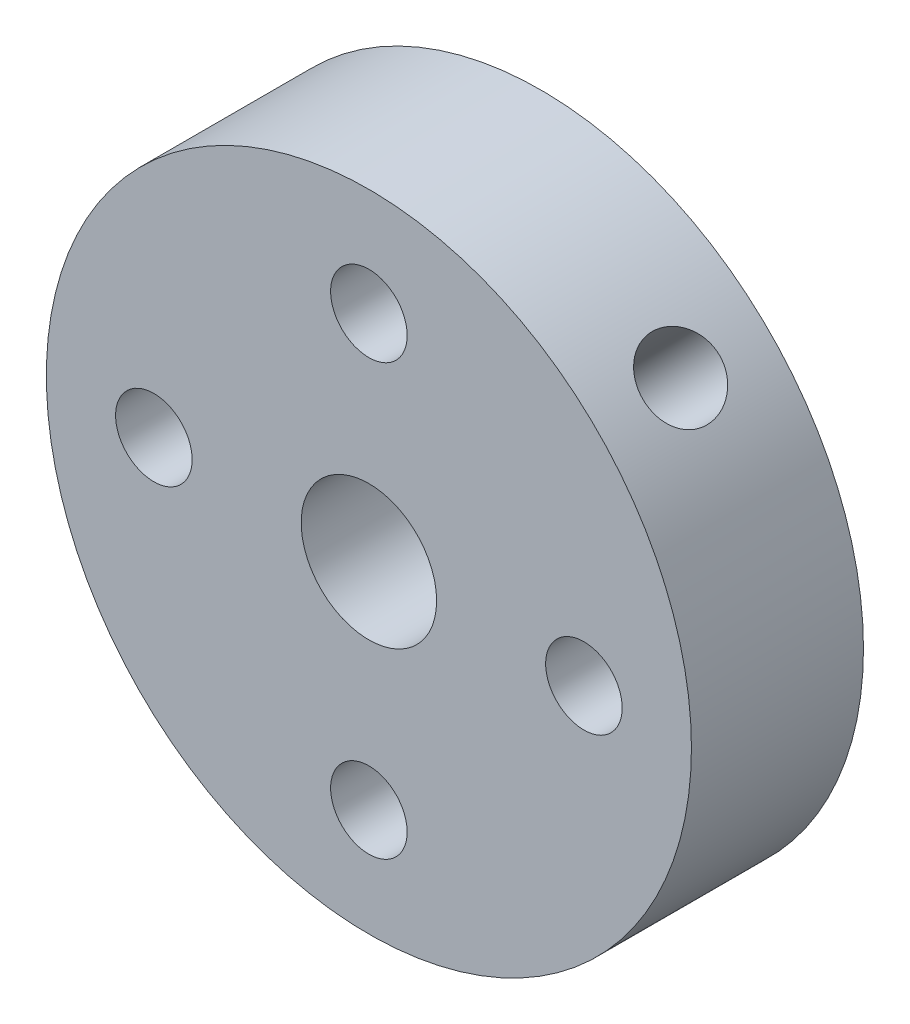
ISO-10303-21;
HEADER;
FILE_DESCRIPTION(('STEP AP214'),'2;1');
FILE_NAME('part.step','',(''),(''),'','','');
FILE_SCHEMA(('AUTOMOTIVE_DESIGN { 1 0 10303 214 1 1 1 1 }'));
ENDSEC;
DATA;
#1=APPLICATION_CONTEXT('core data for automotive mechanical design processes');
#2=APPLICATION_PROTOCOL_DEFINITION('international standard','automotive_design',2000,#1);
#3=PRODUCT_CONTEXT('',#1,'mechanical');
#4=PRODUCT('Part','Part','',(#3));
#5=PRODUCT_RELATED_PRODUCT_CATEGORY('part','',(#4));
#6=PRODUCT_DEFINITION_FORMATION('','',#4);
#7=PRODUCT_DEFINITION_CONTEXT('part definition',#1,'design');
#8=PRODUCT_DEFINITION('design','',#6,#7);
#9=PRODUCT_DEFINITION_SHAPE('','',#8);
#10=(LENGTH_UNIT() NAMED_UNIT(*) SI_UNIT(.MILLI.,.METRE.));
#11=(NAMED_UNIT(*) PLANE_ANGLE_UNIT() SI_UNIT($,.RADIAN.));
#12=(NAMED_UNIT(*) SI_UNIT($,.STERADIAN.) SOLID_ANGLE_UNIT());
#13=UNCERTAINTY_MEASURE_WITH_UNIT(LENGTH_MEASURE(1.E-05),#10,'distance_accuracy_value','');
#14=(GEOMETRIC_REPRESENTATION_CONTEXT(3) GLOBAL_UNCERTAINTY_ASSIGNED_CONTEXT((#13)) GLOBAL_UNIT_ASSIGNED_CONTEXT((#10,
#11,#12)) REPRESENTATION_CONTEXT('',''));
#15=CARTESIAN_POINT('',(0.,0.,0.));
#16=DIRECTION('',(0.,0.,1.));
#17=DIRECTION('',(1.,0.,0.));
#18=AXIS2_PLACEMENT_3D('',#15,#16,#17);
#19=CARTESIAN_POINT('',(0.,0.,5.08));
#20=DIRECTION('',(0.,0.,1.));
#21=DIRECTION('',(1.,0.,0.));
#22=AXIS2_PLACEMENT_3D('',#19,#20,#21);
#23=PLANE('',#22);
#24=CARTESIAN_POINT('',(-6.35,0.,5.08));
#25=DIRECTION('',(0.,0.,1.));
#26=DIRECTION('',(1.,0.,0.));
#27=AXIS2_PLACEMENT_3D('',#24,#25,#26);
#28=CIRCLE('',#27,1.13029999999999);
#29=CARTESIAN_POINT('',(-5.21970000000001,0.,5.08));
#30=VERTEX_POINT('',#29);
#31=EDGE_CURVE('E77',#30,#30,#28,.T.);
#32=ORIENTED_EDGE('',*,*,#31,.F.);
#33=EDGE_LOOP('',(#32));
#34=FACE_BOUND('',#33,.T.);
#35=CARTESIAN_POINT('',(6.35,0.,5.08));
#36=DIRECTION('',(0.,0.,1.));
#37=DIRECTION('',(1.,0.,0.));
#38=AXIS2_PLACEMENT_3D('',#35,#36,#37);
#39=CIRCLE('',#38,1.13029999999999);
#40=CARTESIAN_POINT('',(7.48029999999999,0.,5.08));
#41=VERTEX_POINT('',#40);
#42=EDGE_CURVE('E137',#41,#41,#39,.T.);
#43=ORIENTED_EDGE('',*,*,#42,.F.);
#44=EDGE_LOOP('',(#43));
#45=FACE_BOUND('',#44,.T.);
#46=CARTESIAN_POINT('',(0.,6.35,5.08));
#47=DIRECTION('',(0.,0.,1.));
#48=DIRECTION('',(1.,0.,0.));
#49=AXIS2_PLACEMENT_3D('',#46,#47,#48);
#50=CIRCLE('',#49,1.13029999999999);
#51=CARTESIAN_POINT('',(1.13029999999999,6.35,5.08));
#52=VERTEX_POINT('',#51);
#53=EDGE_CURVE('E141',#52,#52,#50,.T.);
#54=ORIENTED_EDGE('',*,*,#53,.F.);
#55=EDGE_LOOP('',(#54));
#56=FACE_BOUND('',#55,.T.);
#57=CARTESIAN_POINT('',(0.,-6.35,5.08));
#58=DIRECTION('',(0.,0.,1.));
#59=DIRECTION('',(1.,0.,0.));
#60=AXIS2_PLACEMENT_3D('',#57,#58,#59);
#61=CIRCLE('',#60,1.13029999999999);
#62=CARTESIAN_POINT('',(1.13029999999999,-6.35,5.08));
#63=VERTEX_POINT('',#62);
#64=EDGE_CURVE('E144',#63,#63,#61,.T.);
#65=ORIENTED_EDGE('',*,*,#64,.F.);
#66=EDGE_LOOP('',(#65));
#67=FACE_BOUND('',#66,.T.);
#68=CARTESIAN_POINT('',(0.,0.,5.08));
#69=DIRECTION('',(0.,0.,1.));
#70=DIRECTION('',(1.,0.,0.));
#71=AXIS2_PLACEMENT_3D('',#68,#69,#70);
#72=CIRCLE('',#71,9.525);
#73=CARTESIAN_POINT('',(9.525,0.,5.08));
#74=VERTEX_POINT('',#73);
#75=EDGE_CURVE('E82',#74,#74,#72,.T.);
#76=ORIENTED_EDGE('',*,*,#75,.T.);
#77=EDGE_LOOP('',(#76));
#78=FACE_BOUND('',#77,.T.);
#79=CARTESIAN_POINT('',(0.,0.,5.08));
#80=DIRECTION('',(0.,0.,1.));
#81=DIRECTION('',(1.,0.,0.));
#82=AXIS2_PLACEMENT_3D('',#79,#80,#81);
#83=CIRCLE('',#82,2.);
#84=CARTESIAN_POINT('',(2.,0.,5.08));
#85=VERTEX_POINT('',#84);
#86=EDGE_CURVE('E150',#85,#85,#83,.T.);
#87=ORIENTED_EDGE('',*,*,#86,.F.);
#88=EDGE_LOOP('',(#87));
#89=FACE_BOUND('',#88,.T.);
#90=ADVANCED_FACE('F34',(#34,#45,#56,#67,#78,#89),#23,.T.);
#91=CARTESIAN_POINT('',(0.,0.,0.));
#92=DIRECTION('',(0.,0.,1.));
#93=DIRECTION('',(1.,0.,0.));
#94=AXIS2_PLACEMENT_3D('',#91,#92,#93);
#95=PLANE('',#94);
#96=CARTESIAN_POINT('',(-6.35,0.,0.));
#97=DIRECTION('',(0.,0.,1.));
#98=DIRECTION('',(1.,0.,0.));
#99=AXIS2_PLACEMENT_3D('',#96,#97,#98);
#100=CIRCLE('',#99,1.13029999999999);
#101=CARTESIAN_POINT('',(-5.21970000000001,0.,0.));
#102=VERTEX_POINT('',#101);
#103=EDGE_CURVE('E173',#102,#102,#100,.T.);
#104=ORIENTED_EDGE('',*,*,#103,.T.);
#105=EDGE_LOOP('',(#104));
#106=FACE_BOUND('',#105,.T.);
#107=CARTESIAN_POINT('',(6.35,0.,0.));
#108=DIRECTION('',(0.,0.,1.));
#109=DIRECTION('',(1.,0.,0.));
#110=AXIS2_PLACEMENT_3D('',#107,#108,#109);
#111=CIRCLE('',#110,1.13029999999999);
#112=CARTESIAN_POINT('',(7.48029999999999,0.,0.));
#113=VERTEX_POINT('',#112);
#114=EDGE_CURVE('E168',#113,#113,#111,.T.);
#115=ORIENTED_EDGE('',*,*,#114,.T.);
#116=EDGE_LOOP('',(#115));
#117=FACE_BOUND('',#116,.T.);
#118=CARTESIAN_POINT('',(0.,6.35,0.));
#119=DIRECTION('',(0.,0.,1.));
#120=DIRECTION('',(1.,0.,0.));
#121=AXIS2_PLACEMENT_3D('',#118,#119,#120);
#122=CIRCLE('',#121,1.13029999999999);
#123=CARTESIAN_POINT('',(1.13029999999999,6.35,0.));
#124=VERTEX_POINT('',#123);
#125=EDGE_CURVE('E164',#124,#124,#122,.T.);
#126=ORIENTED_EDGE('',*,*,#125,.T.);
#127=EDGE_LOOP('',(#126));
#128=FACE_BOUND('',#127,.T.);
#129=CARTESIAN_POINT('',(0.,-6.35,0.));
#130=DIRECTION('',(0.,0.,1.));
#131=DIRECTION('',(1.,0.,0.));
#132=AXIS2_PLACEMENT_3D('',#129,#130,#131);
#133=CIRCLE('',#132,1.13029999999999);
#134=CARTESIAN_POINT('',(1.13029999999999,-6.35,0.));
#135=VERTEX_POINT('',#134);
#136=EDGE_CURVE('E157',#135,#135,#133,.T.);
#137=ORIENTED_EDGE('',*,*,#136,.T.);
#138=EDGE_LOOP('',(#137));
#139=FACE_BOUND('',#138,.T.);
#140=CARTESIAN_POINT('',(0.,0.,0.));
#141=DIRECTION('',(0.,0.,1.));
#142=DIRECTION('',(1.,0.,0.));
#143=AXIS2_PLACEMENT_3D('',#140,#141,#142);
#144=CIRCLE('',#143,9.525);
#145=CARTESIAN_POINT('',(9.525,0.,0.));
#146=VERTEX_POINT('',#145);
#147=EDGE_CURVE('E151',#146,#146,#144,.T.);
#148=ORIENTED_EDGE('',*,*,#147,.F.);
#149=EDGE_LOOP('',(#148));
#150=FACE_BOUND('',#149,.T.);
#151=CARTESIAN_POINT('',(0.,0.,0.));
#152=DIRECTION('',(0.,0.,1.));
#153=DIRECTION('',(1.,0.,0.));
#154=AXIS2_PLACEMENT_3D('',#151,#152,#153);
#155=CIRCLE('',#154,2.);
#156=CARTESIAN_POINT('',(2.,0.,0.));
#157=VERTEX_POINT('',#156);
#158=EDGE_CURVE('E152',#157,#157,#155,.T.);
#159=ORIENTED_EDGE('',*,*,#158,.T.);
#160=EDGE_LOOP('',(#159));
#161=FACE_BOUND('',#160,.T.);
#162=ADVANCED_FACE('F125',(#106,#117,#128,#139,#150,#161),#95,.F.);
#163=CARTESIAN_POINT('',(0.,0.,5.08));
#164=DIRECTION('',(0.,0.,-1.));
#165=DIRECTION('',(-1.,0.,0.));
#166=AXIS2_PLACEMENT_3D('',#163,#164,#165);
#167=CYLINDRICAL_SURFACE('',#166,9.525);
#168=CARTESIAN_POINT('',(5.82898995376641,7.53316010176939,2.54));
#169=CARTESIAN_POINT('',(5.82899248952734,7.53315882328981,2.47675083023152));
#170=CARTESIAN_POINT('',(5.8332361404265,7.52988040817626,2.41346150046686));
#171=CARTESIAN_POINT('',(5.85006139317577,7.51681553384141,2.28864237142658));
#172=CARTESIAN_POINT('',(5.86265183832785,7.5070221720948,2.22711451060301));
#173=CARTESIAN_POINT('',(5.89568503198347,7.48110693222423,2.10764367538077));
#174=CARTESIAN_POINT('',(5.91612260717225,7.46498922334874,2.04969836829954));
#175=CARTESIAN_POINT('',(5.96409101066878,7.42672069850308,1.93898333748816));
#176=CARTESIAN_POINT('',(5.99162057277892,7.4045709594464,1.8862126921977));
#177=CARTESIAN_POINT('',(6.05293285013415,7.35453581682226,1.78706674838293));
#178=CARTESIAN_POINT('',(6.08674322944771,7.32662497537555,1.74072139175398));
#179=CARTESIAN_POINT('',(6.15936552415916,7.26567848903774,1.65600003105463));
#180=CARTESIAN_POINT('',(6.19817768262808,7.232642595069,1.61762441452586));
#181=CARTESIAN_POINT('',(6.27962649209515,7.16204055449252,1.54982538353729));
#182=CARTESIAN_POINT('',(6.32227417209121,7.12446122923,1.52042892784533));
#183=CARTESIAN_POINT('',(6.40990406715616,7.04572357143958,1.47159528680367));
#184=CARTESIAN_POINT('',(6.45488620370924,7.00456535925056,1.45215776673945));
#185=CARTESIAN_POINT('',(6.54555274951747,6.91991262477962,1.42388283449898));
#186=CARTESIAN_POINT('',(6.59123283620744,6.87643006062063,1.41499577009915));
#187=CARTESIAN_POINT('',(6.68213121283513,6.78813384832554,1.40792020794055));
#188=CARTESIAN_POINT('',(6.72734951918781,6.7433202477268,1.40973132855719));
#189=CARTESIAN_POINT('',(6.81581610948556,6.65388710450455,1.42396079393403));
#190=CARTESIAN_POINT('',(6.85907315810882,6.60926771951411,1.43632574183471));
#191=CARTESIAN_POINT('',(6.94272262819066,6.52134281746578,1.4712284739618));
#192=CARTESIAN_POINT('',(6.98311499977223,6.47803732329162,1.49376643526072));
#193=CARTESIAN_POINT('',(7.06014828549854,6.39399656175365,1.54843268947245));
#194=CARTESIAN_POINT('',(7.09677981224391,6.35326781889162,1.58058423267741));
#195=CARTESIAN_POINT('',(7.1653591958131,6.27582125818784,1.6535480827993));
#196=CARTESIAN_POINT('',(7.19730685890878,6.23910360626385,1.694360747776));
#197=CARTESIAN_POINT('',(7.25603619891689,6.17070600490738,1.7837877304075));
#198=CARTESIAN_POINT('',(7.28278483823402,6.13905848380714,1.83244856131957));
#199=CARTESIAN_POINT('',(7.33034096088078,6.08219572280968,1.93603038653667));
#200=CARTESIAN_POINT('',(7.35114842874566,6.05698049965561,1.99095139713626));
#201=CARTESIAN_POINT('',(7.3864336492711,6.01390076463735,2.10553426776171));
#202=CARTESIAN_POINT('',(7.40090912659505,5.99603889526177,2.16519782288701));
#203=CARTESIAN_POINT('',(7.42324833271865,5.96836061446144,2.28755178056523));
#204=CARTESIAN_POINT('',(7.43111234770603,5.95854385479172,2.35024205197766));
#205=CARTESIAN_POINT('',(7.44005611206826,5.94737268413058,2.47646170976712));
#206=CARTESIAN_POINT('',(7.44117682903162,5.94596717252863,2.53998367450721));
#207=CARTESIAN_POINT('',(7.43672292332219,5.95153672396322,2.66642145646119));
#208=CARTESIAN_POINT('',(7.43114842893879,5.95851162641959,2.72933728526618));
#209=CARTESIAN_POINT('',(7.41343369538823,5.98053697766329,2.85258339037514));
#210=CARTESIAN_POINT('',(7.40131331770322,5.99556299671559,2.91292089524452));
#211=CARTESIAN_POINT('',(7.37074134594596,6.03310696380086,3.02952333352778));
#212=CARTESIAN_POINT('',(7.35228955034455,6.05562515030898,3.08578813723846));
#213=CARTESIAN_POINT('',(7.30929335547662,6.10745368199031,3.19294290180759));
#214=CARTESIAN_POINT('',(7.28472031673952,6.13679591071934,3.24380594689318));
#215=CARTESIAN_POINT('',(7.22999936025515,6.20117040065308,3.33843921221187));
#216=CARTESIAN_POINT('',(7.19985124744005,6.23620286094969,3.38220918416287));
#217=CARTESIAN_POINT('',(7.1344245451749,6.31094970514715,3.46164117510912));
#218=CARTESIAN_POINT('',(7.09912048026152,6.35068714011351,3.49726053799616));
#219=CARTESIAN_POINT('',(7.0242783291007,6.43336957413763,3.55908550257746));
#220=CARTESIAN_POINT('',(6.98474032092426,6.4763145140468,3.58529127781297));
#221=CARTESIAN_POINT('',(6.90248082260541,6.56391512148532,3.62747423592634));
#222=CARTESIAN_POINT('',(6.85976738690606,6.60856632995088,3.64347637414355));
#223=CARTESIAN_POINT('',(6.77218271192448,6.69829041773298,3.66487907550035));
#224=CARTESIAN_POINT('',(6.72731155993536,6.74336327993166,3.67028006715351));
#225=CARTESIAN_POINT('',(6.63694420260522,6.83231968850389,3.67031970142615));
#226=CARTESIAN_POINT('',(6.5914535285176,6.87620883902143,3.66502423763514));
#227=CARTESIAN_POINT('',(6.50090997394544,6.9618733228803,3.6439604605265));
#228=CARTESIAN_POINT('',(6.45585709335745,7.00364865672117,3.62819214968381));
#229=CARTESIAN_POINT('',(6.36757994587295,7.08400418182488,3.58665033089501));
#230=CARTESIAN_POINT('',(6.32435516587411,7.12258527258289,3.56087965131118));
#231=CARTESIAN_POINT('',(6.24108818476464,7.19565950126021,3.50007146474907));
#232=CARTESIAN_POINT('',(6.20104600625499,7.23015261014991,3.46503389197036));
#233=CARTESIAN_POINT('',(6.12522762931531,7.29449810502292,3.38644164568461));
#234=CARTESIAN_POINT('',(6.08947801965806,7.32432188274187,3.34283789712582));
#235=CARTESIAN_POINT('',(6.02373535241923,7.37848607374184,3.24845211130753));
#236=CARTESIAN_POINT('',(5.99374366464914,7.40282518245703,3.19766837090296));
#237=CARTESIAN_POINT('',(5.94049794017068,7.44562178544132,3.09016285265354));
#238=CARTESIAN_POINT('',(5.91726777672003,7.46405846203853,3.03342097479023));
#239=CARTESIAN_POINT('',(5.87856741671868,7.49457690720485,2.91578612799387));
#240=CARTESIAN_POINT('',(5.86308869457894,7.50666565839035,2.85489780375564));
#241=CARTESIAN_POINT('',(5.84421749181607,7.52135848581757,2.75140489514775));
#242=CARTESIAN_POINT('',(5.83851734998419,7.52577993540667,2.7094557203659));
#243=CARTESIAN_POINT('',(5.83090274116921,7.53168116339257,2.62501040961091));
#244=CARTESIAN_POINT('',(5.82898824930067,7.53316096112669,2.58251427723511));
#245=CARTESIAN_POINT('',(5.82898995376641,7.53316010176939,2.54));
#246=B_SPLINE_CURVE_WITH_KNOTS('',3,(#168,#169,#170,#171,#172,#173,#174,#175,#176,#177,#178,
#179,#180,#181,#182,#183,#184,#185,#186,#187,#188,#189,#190,#191,#192,#193,#194,#195,#196,#197,
#198,#199,#200,#201,#202,#203,#204,#205,#206,#207,#208,#209,#210,#211,#212,#213,#214,#215,#216,
#217,#218,#219,#220,#221,#222,#223,#224,#225,#226,#227,#228,#229,#230,#231,#232,#233,#234,#235,
#236,#237,#238,#239,#240,#241,#242,#243,#244,#245),.UNSPECIFIED.,.T.,.F.,(4,2,2,2,2,2,2,2,2,2,2,
2,2,2,2,2,2,2,2,2,2,2,2,2,2,2,2,2,2,2,2,2,2,2,2,2,2,2,4),(0.,0.189592213889248,
0.379385619561863,0.569054115897606,0.758688772414142,0.949179385544412,1.13967925942421,
1.33074558653032,1.52180549157745,1.71196262630947,1.90211297781597,2.09130693212655,
2.28050417969349,2.47016275053478,2.65982916358624,2.85066401887304,3.04149937089373,
3.23240324144269,3.42329884798679,3.61303352504163,3.80276456657901,3.99192313524187,
4.18108772538458,4.37115455334497,4.56122803286593,4.75227459942105,4.9433176438163,
5.13389163804306,5.32445792883666,5.51385385073957,5.7032497278842,5.89259208867047,
6.0819357939356,6.27239765084121,6.46290476268857,6.65407656758028,6.84503764369964,
6.97247692802289,7.09991537460502),.UNSPECIFIED.);
#247=CARTESIAN_POINT('',(5.82898995376641,7.53316010176939,2.54));
#248=VERTEX_POINT('',#247);
#249=EDGE_CURVE('E11',#248,#248,#246,.T.);
#250=ORIENTED_EDGE('',*,*,#249,.T.);
#251=EDGE_LOOP('',(#250));
#252=FACE_BOUND('',#251,.T.);
#253=ORIENTED_EDGE('',*,*,#75,.F.);
#254=EDGE_LOOP('',(#253));
#255=FACE_BOUND('',#254,.T.);
#256=ORIENTED_EDGE('',*,*,#147,.T.);
#257=EDGE_LOOP('',(#256));
#258=FACE_BOUND('',#257,.T.);
#259=ADVANCED_FACE('F36',(#252,#255,#258),#167,.T.);
#260=CARTESIAN_POINT('',(0.,0.,5.08));
#261=DIRECTION('',(0.,0.,-1.));
#262=DIRECTION('',(-1.,0.,0.));
#263=AXIS2_PLACEMENT_3D('',#260,#261,#262);
#264=CYLINDRICAL_SURFACE('',#263,2.);
#265=CARTESIAN_POINT('',(0.942765379817911,1.7638576659317,1.57400994461739));
#266=CARTESIAN_POINT('',(0.972965665230928,1.74771558801912,1.53611245666618));
#267=CARTESIAN_POINT('',(1.00493721647884,1.72963851575897,1.5004369106523));
#268=CARTESIAN_POINT('',(1.07201247430749,1.68888163321924,1.43514979373124));
#269=CARTESIAN_POINT('',(1.10710983100936,1.66621104003339,1.40552631445478));
#270=CARTESIAN_POINT('',(1.16952764024255,1.62272077585374,1.36161916917898));
#271=CARTESIAN_POINT('',(1.19630724310353,1.60312978829394,1.34535954552499));
#272=CARTESIAN_POINT('',(1.25046603673101,1.56125017061652,1.31815439492318));
#273=CARTESIAN_POINT('',(1.27784463605811,1.53896411111027,1.3072038532479));
#274=CARTESIAN_POINT('',(1.33256886887931,1.49183468787534,1.29144497615291));
#275=CARTESIAN_POINT('',(1.35991284490752,1.46697406265058,1.28668144416827));
#276=CARTESIAN_POINT('',(1.4133357165779,1.41557557566414,1.28392610875326));
#277=CARTESIAN_POINT('',(1.43941497461585,1.38903819944279,1.28593235372287));
#278=CARTESIAN_POINT('',(1.48689950377527,1.33799247038595,1.29596402125353));
#279=CARTESIAN_POINT('',(1.50851110634489,1.31354821860123,1.30336428443717));
#280=CARTESIAN_POINT('',(1.54961852513178,1.26479294554884,1.32290496277592));
#281=CARTESIAN_POINT('',(1.56911337771975,1.24048198970485,1.33504752534866));
#282=CARTESIAN_POINT('',(1.61286543910341,1.18338754510347,1.36876393369395));
#283=CARTESIAN_POINT('',(1.63610469706877,1.15090753047138,1.39216851560449));
#284=CARTESIAN_POINT('',(1.67852706940147,1.0881137484435,1.44483509176085));
#285=CARTESIAN_POINT('',(1.69770056721735,1.05780522675971,1.4741106613359));
#286=CARTESIAN_POINT('',(1.73992384898652,0.987421123432539,1.55054563869246));
#287=CARTESIAN_POINT('',(1.76111463822528,0.948724719610566,1.59999320815711));
#288=CARTESIAN_POINT('',(1.79768639714185,0.877455772585087,1.70500519342754));
#289=CARTESIAN_POINT('',(1.81305970073514,0.844891338058423,1.76057755669175));
#290=CARTESIAN_POINT('',(1.83965238146453,0.785352721555829,1.87820244639763));
#291=CARTESIAN_POINT('',(1.85070150513942,0.758623181396234,1.94041660698138));
#292=CARTESIAN_POINT('',(1.86876507207506,0.712963847184293,2.06814923415017));
#293=CARTESIAN_POINT('',(1.87578099716724,0.694031189217242,2.13366647751894));
#294=CARTESIAN_POINT('',(1.88756544732528,0.661417025450461,2.28139818564163));
#295=CARTESIAN_POINT('',(1.89151160361027,0.649777508645414,2.36414121402937));
#296=CARTESIAN_POINT('',(1.89488284229155,0.639880236762597,2.53053676696619));
#297=CARTESIAN_POINT('',(1.89430640830876,0.64162696995541,2.61418958717052));
#298=CARTESIAN_POINT('',(1.88855051809995,0.658370519504493,2.78000311844544));
#299=CARTESIAN_POINT('',(1.88336995509441,0.67337052178879,2.86216346589653));
#300=CARTESIAN_POINT('',(1.86771023187674,0.715656990643006,3.02280376646204));
#301=CARTESIAN_POINT('',(1.8572276684559,0.742951347388889,3.1012813202924));
#302=CARTESIAN_POINT('',(1.83174391396497,0.803502720068949,3.24057682090817));
#303=CARTESIAN_POINT('',(1.81768735972735,0.835193869894707,3.30225303589249));
#304=CARTESIAN_POINT('',(1.78355280386816,0.90580276195693,3.41950501868627));
#305=CARTESIAN_POINT('',(1.76348663706933,0.94470624398977,3.47509248598276));
#306=CARTESIAN_POINT('',(1.72359333811128,1.01502232648681,3.56037753752476));
#307=CARTESIAN_POINT('',(1.7058934001303,1.04464111664185,3.59254787967639));
#308=CARTESIAN_POINT('',(1.66648101615738,1.1064262481241,3.65157066420369));
#309=CARTESIAN_POINT('',(1.64477481630121,1.13858857982464,3.67843125179474));
#310=CARTESIAN_POINT('',(1.60191344423151,1.19788055129197,3.72022632844237));
#311=CARTESIAN_POINT('',(1.58158048294757,1.22466775608375,3.73647914589684));
#312=CARTESIAN_POINT('',(1.53815451556217,1.27878057493396,3.76351205029596));
#313=CARTESIAN_POINT('',(1.51506398472512,1.30610568802012,3.77429700038986));
#314=CARTESIAN_POINT('',(1.46630084813966,1.36062709949336,3.78954739433209));
#315=CARTESIAN_POINT('',(1.44061077908769,1.38782103774188,3.79396657888547));
#316=CARTESIAN_POINT('',(1.38759868019017,1.44082373589119,3.79587603112625));
#317=CARTESIAN_POINT('',(1.36027710731694,1.46663287985326,3.7933682301881));
#318=CARTESIAN_POINT('',(1.30812170181956,1.51324354454431,3.78234982234992));
#319=CARTESIAN_POINT('',(1.28334755201035,1.53428307883746,3.77453494326654));
#320=CARTESIAN_POINT('',(1.23401805997921,1.57423270477072,3.75422905977954));
#321=CARTESIAN_POINT('',(1.20946281412583,1.59314189744465,3.74173609084862));
#322=CARTESIAN_POINT('',(1.15146000163069,1.63581871072437,3.70701963492682));
#323=CARTESIAN_POINT('',(1.11836531102706,1.65852242600581,3.68290238618377));
#324=CARTESIAN_POINT('',(1.05450183974152,1.699847473283,3.62879524765138));
#325=CARTESIAN_POINT('',(1.02373881437069,1.71845890630341,3.59879144298486));
#326=CARTESIAN_POINT('',(0.952397650568349,1.75934194888803,3.52055649195811));
#327=CARTESIAN_POINT('',(0.913278121582034,1.77975284022674,3.47003121075655));
#328=CARTESIAN_POINT('',(0.841443117464981,1.81481992598365,3.36286695365218));
#329=CARTESIAN_POINT('',(0.808735991428454,1.82946864255285,3.30622015422308));
#330=CARTESIAN_POINT('',(0.749213975607567,1.85465853865687,3.18645722931817));
#331=CARTESIAN_POINT('',(0.722649108738256,1.86503567184825,3.1231829424563));
#332=CARTESIAN_POINT('',(0.677628454778897,1.88185940902505,2.9933710049673));
#333=CARTESIAN_POINT('',(0.659169036746911,1.88830777345661,2.92683483042511));
#334=CARTESIAN_POINT('',(0.628107600849743,1.8988987035235,2.77767372346525));
#335=CARTESIAN_POINT('',(0.617506440524246,1.90228861812535,2.69456722882176));
#336=CARTESIAN_POINT('',(0.609848770259591,1.9047573740513,2.52762724759223));
#337=CARTESIAN_POINT('',(0.612800057751927,1.90383373355653,2.443793370195));
#338=CARTESIAN_POINT('',(0.632006580830705,1.89754186668016,2.27805437279721));
#339=CARTESIAN_POINT('',(0.648230356553019,1.89218415006868,2.19614516254361));
#340=CARTESIAN_POINT('',(0.692920956979798,1.87627882001326,2.03626022743254));
#341=CARTESIAN_POINT('',(0.72138462716112,1.86573254368847,1.95828349485979));
#342=CARTESIAN_POINT('',(0.780721400196832,1.84152624229339,1.82751108733124));
#343=CARTESIAN_POINT('',(0.809168853884187,1.82932610220908,1.77333084118952));
#344=CARTESIAN_POINT('',(0.87179192145826,1.80032551574956,1.66967271565862));
#345=CARTESIAN_POINT('',(0.90596351252048,1.78352829490487,1.62019157182431));
#346=CARTESIAN_POINT('',(0.942765379817911,1.7638576659317,1.57400994461739));
#347=B_SPLINE_CURVE_WITH_KNOTS('',3,(#265,#266,#267,#268,#269,#270,#271,#272,#273,#274,#275,
#276,#277,#278,#279,#280,#281,#282,#283,#284,#285,#286,#287,#288,#289,#290,#291,#292,#293,#294,
#295,#296,#297,#298,#299,#300,#301,#302,#303,#304,#305,#306,#307,#308,#309,#310,#311,#312,#313,
#314,#315,#316,#317,#318,#319,#320,#321,#322,#323,#324,#325,#326,#327,#328,#329,#330,#331,#332,
#333,#334,#335,#336,#337,#338,#339,#340,#341,#342,#343,#344,#345,#346),.UNSPECIFIED.,.T.,.F.,(4,
2,2,2,2,2,2,2,2,2,2,2,2,2,2,2,2,2,2,2,2,2,2,2,2,2,2,2,2,2,2,2,2,2,2,2,2,2,2,2,4),(0.,
0.153096896370157,0.305889586523242,0.416331645697575,0.526669181887371,0.637801356299803,
0.748901496123244,0.848836617606741,0.948817044480693,1.08691492844434,1.22533589270628,
1.42306466401262,1.62105309564286,1.82619876548693,2.03126901481787,2.28100633831719,
2.53082739980967,2.78070853165356,3.03075025927593,3.24228027758635,3.45339643553777,
3.59450629363608,3.73539797877257,3.84702197907845,3.95854652549301,4.0708774891746,
4.18317713602273,4.28303690064426,4.38293864770885,4.52262350788216,4.66264262794139,
4.86279437521575,5.06320501871403,5.27072119610184,5.4781443188272,5.72846419263954,
5.97892810659641,6.22880005856122,6.4786076509116,6.66530117108145,6.85186403255145),.UNSPECIFIED.);
#348=CARTESIAN_POINT('',(1.73704863013049,0.991293123431095,1.54843402135799));
#349=VERTEX_POINT('',#348);
#350=CARTESIAN_POINT('',(1.73704863013049,0.991293123431095,3.53156597864201));
#351=VERTEX_POINT('',#350);
#352=EDGE_CURVE('E46',#349,#351,#347,.T.);
#353=ORIENTED_EDGE('',*,*,#352,.F.);
#354=CARTESIAN_POINT('',(0.963706431543322,1.75250389837,1.54843402135799));
#355=CARTESIAN_POINT('',(0.986253169589014,1.74010620856171,1.5348841752265));
#356=CARTESIAN_POINT('',(1.00896137462089,1.72705062829423,1.52222295114575));
#357=CARTESIAN_POINT('',(1.05454889471623,1.6995986635734,1.49876890082204));
#358=CARTESIAN_POINT('',(1.07742828976853,1.68520161098982,1.48797701334876));
#359=CARTESIAN_POINT('',(1.14608039123643,1.63996753289901,1.45855303312552));
#360=CARTESIAN_POINT('',(1.1918476594555,1.6070980456753,1.44288425371334));
#361=CARTESIAN_POINT('',(1.28182014098624,1.53630260568295,1.42017919829448));
#362=CARTESIAN_POINT('',(1.32601991807857,1.49836088987277,1.41317056068763));
#363=CARTESIAN_POINT('',(1.41112642827239,1.41849184818199,1.40824597232226));
#364=CARTESIAN_POINT('',(1.45203729728881,1.37656967736136,1.41031841371137));
#365=CARTESIAN_POINT('',(1.52758215442924,1.29211435064573,1.42310606202039));
#366=CARTESIAN_POINT('',(1.56241895956856,1.24969916690503,1.43341702933069));
#367=CARTESIAN_POINT('',(1.6273850952515,1.16383560458352,1.46171027821388));
#368=CARTESIAN_POINT('',(1.65751524831558,1.12038740806152,1.47969121735179));
#369=CARTESIAN_POINT('',(1.69435725409676,1.06275504463749,1.50827478030397));
#370=CARTESIAN_POINT('',(1.703285554398,1.04837965853123,1.51580022326196));
#371=CARTESIAN_POINT('',(1.72057911573442,1.01974768970821,1.53157656218093));
#372=CARTESIAN_POINT('',(1.72894571989696,1.00549090061766,1.53982561023025));
#373=CARTESIAN_POINT('',(1.7370486301305,0.991293123431092,1.54843402135798));
#374=B_SPLINE_CURVE_WITH_KNOTS('',3,(#354,#355,#356,#357,#358,#359,#360,#361,#362,#363,#364,
#365,#366,#367,#368,#369,#370,#371,#372,#373),.UNSPECIFIED.,.F.,.F.,(4,2,2,2,2,2,2,2,2,4),(0.,
0.0871990280695105,0.174441720804663,0.349000890500394,0.524115729877987,0.699006794765795,
0.865807591466382,1.03257920586838,1.08812424436423,1.14353134885075),.UNSPECIFIED.);
#375=CARTESIAN_POINT('',(0.963706431543322,1.75250389837,1.54843402135799));
#376=VERTEX_POINT('',#375);
#377=EDGE_CURVE('E71',#376,#349,#374,.T.);
#378=ORIENTED_EDGE('',*,*,#377,.F.);
#379=CARTESIAN_POINT('',(0.963706431543065,1.75250389837017,3.5315659786419));
#380=VERTEX_POINT('',#379);
#381=EDGE_CURVE('E56',#380,#376,#347,.T.);
#382=ORIENTED_EDGE('',*,*,#381,.F.);
#383=CARTESIAN_POINT('',(1.73704863013049,0.991293123431095,3.53156597864201));
#384=CARTESIAN_POINT('',(1.7242960252229,1.01364103557417,3.5451158247735));
#385=CARTESIAN_POINT('',(1.7108830592853,1.03613999325329,3.55777704885425));
#386=CARTESIAN_POINT('',(1.68271378555145,1.08128779910013,3.58123109917796));
#387=CARTESIAN_POINT('',(1.66795680844385,1.10393671668353,3.59202298665124));
#388=CARTESIAN_POINT('',(1.62164299210085,1.1718650853702,3.62144696687447));
#389=CARTESIAN_POINT('',(1.58805403115703,1.21710696567263,3.63711574628666));
#390=CARTESIAN_POINT('',(1.51584497185115,1.30594892372551,3.65982080170552));
#391=CARTESIAN_POINT('',(1.47720919836451,1.34954331672188,3.66682943931237));
#392=CARTESIAN_POINT('',(1.39600460259736,1.43337645768813,3.67175402767774));
#393=CARTESIAN_POINT('',(1.35344086934354,1.47361942255766,3.66968158628863));
#394=CARTESIAN_POINT('',(1.26780173181171,1.54781959623547,3.65689393797961));
#395=CARTESIAN_POINT('',(1.22484107839967,1.58198146185318,3.64658297066931));
#396=CARTESIAN_POINT('',(1.13796113119296,1.64558197201994,3.61828972178612));
#397=CARTESIAN_POINT('',(1.09404200643026,1.67502144186501,3.60030878264821));
#398=CARTESIAN_POINT('',(1.03583437298926,1.71094767340989,3.57172521969603));
#399=CARTESIAN_POINT('',(1.02131962690011,1.71964758248647,3.56419977673804));
#400=CARTESIAN_POINT('',(0.99241782493112,1.73648631003116,3.54842343781907));
#401=CARTESIAN_POINT('',(0.978030541468397,1.74462646819598,3.54017438976976));
#402=CARTESIAN_POINT('',(0.963706431543318,1.75250389837,3.53156597864202));
#403=B_SPLINE_CURVE_WITH_KNOTS('',3,(#383,#384,#385,#386,#387,#388,#389,#390,#391,#392,#393,
#394,#395,#396,#397,#398,#399,#400,#401,#402),.UNSPECIFIED.,.F.,.F.,(4,2,2,2,2,2,2,2,2,4),(0.,
0.0871990280695109,0.174441720804664,0.349000890500394,0.524115729877987,0.699006794765796,
0.865807591466382,1.03257920586838,1.08812424436423,1.14353134885075),.UNSPECIFIED.);
#404=EDGE_CURVE('E76',#351,#380,#403,.T.);
#405=ORIENTED_EDGE('',*,*,#404,.F.);
#406=EDGE_LOOP('',(#353,#378,#382,#405));
#407=FACE_BOUND('',#406,.T.);
#408=ORIENTED_EDGE('',*,*,#86,.T.);
#409=EDGE_LOOP('',(#408));
#410=FACE_BOUND('',#409,.T.);
#411=ORIENTED_EDGE('',*,*,#158,.F.);
#412=EDGE_LOOP('',(#411));
#413=FACE_BOUND('',#412,.T.);
#414=ADVANCED_FACE('F79',(#407,#410,#413),#264,.F.);
#415=CARTESIAN_POINT('',(0.,-6.35,5.08));
#416=DIRECTION('',(0.,0.,1.));
#417=DIRECTION('',(1.,0.,0.));
#418=AXIS2_PLACEMENT_3D('',#415,#416,#417);
#419=CYLINDRICAL_SURFACE('',#418,1.13029999999999);
#420=ORIENTED_EDGE('',*,*,#64,.T.);
#421=EDGE_LOOP('',(#420));
#422=FACE_BOUND('',#421,.T.);
#423=ORIENTED_EDGE('',*,*,#136,.F.);
#424=EDGE_LOOP('',(#423));
#425=FACE_BOUND('',#424,.T.);
#426=ADVANCED_FACE('F115',(#422,#425),#419,.F.);
#427=CARTESIAN_POINT('',(0.,6.35,5.08));
#428=DIRECTION('',(0.,0.,1.));
#429=DIRECTION('',(1.,0.,0.));
#430=AXIS2_PLACEMENT_3D('',#427,#428,#429);
#431=CYLINDRICAL_SURFACE('',#430,1.13029999999999);
#432=ORIENTED_EDGE('',*,*,#53,.T.);
#433=EDGE_LOOP('',(#432));
#434=FACE_BOUND('',#433,.T.);
#435=ORIENTED_EDGE('',*,*,#125,.F.);
#436=EDGE_LOOP('',(#435));
#437=FACE_BOUND('',#436,.T.);
#438=ADVANCED_FACE('F112',(#434,#437),#431,.F.);
#439=CARTESIAN_POINT('',(6.35,0.,5.08));
#440=DIRECTION('',(0.,0.,1.));
#441=DIRECTION('',(1.,0.,0.));
#442=AXIS2_PLACEMENT_3D('',#439,#440,#441);
#443=CYLINDRICAL_SURFACE('',#442,1.13029999999999);
#444=ORIENTED_EDGE('',*,*,#42,.T.);
#445=EDGE_LOOP('',(#444));
#446=FACE_BOUND('',#445,.T.);
#447=ORIENTED_EDGE('',*,*,#114,.F.);
#448=EDGE_LOOP('',(#447));
#449=FACE_BOUND('',#448,.T.);
#450=ADVANCED_FACE('F108',(#446,#449),#443,.F.);
#451=CARTESIAN_POINT('',(-6.35,0.,5.08));
#452=DIRECTION('',(0.,0.,1.));
#453=DIRECTION('',(1.,0.,0.));
#454=AXIS2_PLACEMENT_3D('',#451,#452,#453);
#455=CYLINDRICAL_SURFACE('',#454,1.13029999999999);
#456=ORIENTED_EDGE('',*,*,#31,.T.);
#457=EDGE_LOOP('',(#456));
#458=FACE_BOUND('',#457,.T.);
#459=ORIENTED_EDGE('',*,*,#103,.F.);
#460=EDGE_LOOP('',(#459));
#461=FACE_BOUND('',#460,.T.);
#462=ADVANCED_FACE('F99',(#458,#461),#455,.F.);
#463=CARTESIAN_POINT('',(6.68173817206291,6.78822509939078,2.54));
#464=DIRECTION('',(0.701494821213948,0.712674551117136,0.));
#465=DIRECTION('',(-0.712674551117136,0.701494821213948,0.));
#466=AXIS2_PLACEMENT_3D('',#463,#464,#465);
#467=CYLINDRICAL_SURFACE('',#466,1.13029999999999);
#468=ORIENTED_EDGE('',*,*,#377,.T.);
#469=CARTESIAN_POINT('',(1.35037753083691,1.37189851090055,2.54));
#470=DIRECTION('',(0.701494821213948,0.712674551117136,0.));
#471=DIRECTION('',(-0.712674551117136,0.701494821213948,0.));
#472=AXIS2_PLACEMENT_3D('',#469,#470,#471);
#473=CIRCLE('',#472,1.13029999999999);
#474=EDGE_CURVE('E67',#351,#349,#473,.T.);
#475=ORIENTED_EDGE('',*,*,#474,.F.);
#476=ORIENTED_EDGE('',*,*,#404,.T.);
#477=EDGE_CURVE('E52',#376,#380,#473,.T.);
#478=ORIENTED_EDGE('',*,*,#477,.F.);
#479=EDGE_LOOP('',(#468,#475,#476,#478));
#480=FACE_BOUND('',#479,.T.);
#481=ORIENTED_EDGE('',*,*,#249,.F.);
#482=EDGE_LOOP('',(#481));
#483=FACE_BOUND('',#482,.T.);
#484=ADVANCED_FACE('F74',(#480,#483),#467,.F.);
#485=CARTESIAN_POINT('',(1.35037753083691,1.37189851090055,2.54));
#486=DIRECTION('',(0.701494821213948,0.712674551117136,0.));
#487=DIRECTION('',(-0.712674551117136,0.701494821213948,0.));
#488=AXIS2_PLACEMENT_3D('',#485,#486,#487);
#489=CONICAL_SURFACE('',#488,1.13029999999999,1.02974425867665);
#490=ORIENTED_EDGE('',*,*,#352,.T.);
#491=ORIENTED_EDGE('',*,*,#474,.T.);
#492=EDGE_LOOP('',(#490,#491));
#493=FACE_BOUND('',#492,.T.);
#494=ADVANCED_FACE('F66',(#493),#489,.F.);
#495=ORIENTED_EDGE('',*,*,#381,.T.);
#496=ORIENTED_EDGE('',*,*,#477,.T.);
#497=EDGE_LOOP('',(#495,#496));
#498=FACE_BOUND('',#497,.T.);
#499=ADVANCED_FACE('F100',(#498),#489,.F.);
#500=CLOSED_SHELL('',(#90,#162,#259,#414,#426,#438,#450,#462,#484,#494,#499));
#501=MANIFOLD_SOLID_BREP('B2',#500);
#502=ADVANCED_BREP_SHAPE_REPRESENTATION('',(#18,#501),#14);
#503=SHAPE_DEFINITION_REPRESENTATION(#9,#502);
ENDSEC;
END-ISO-10303-21;
